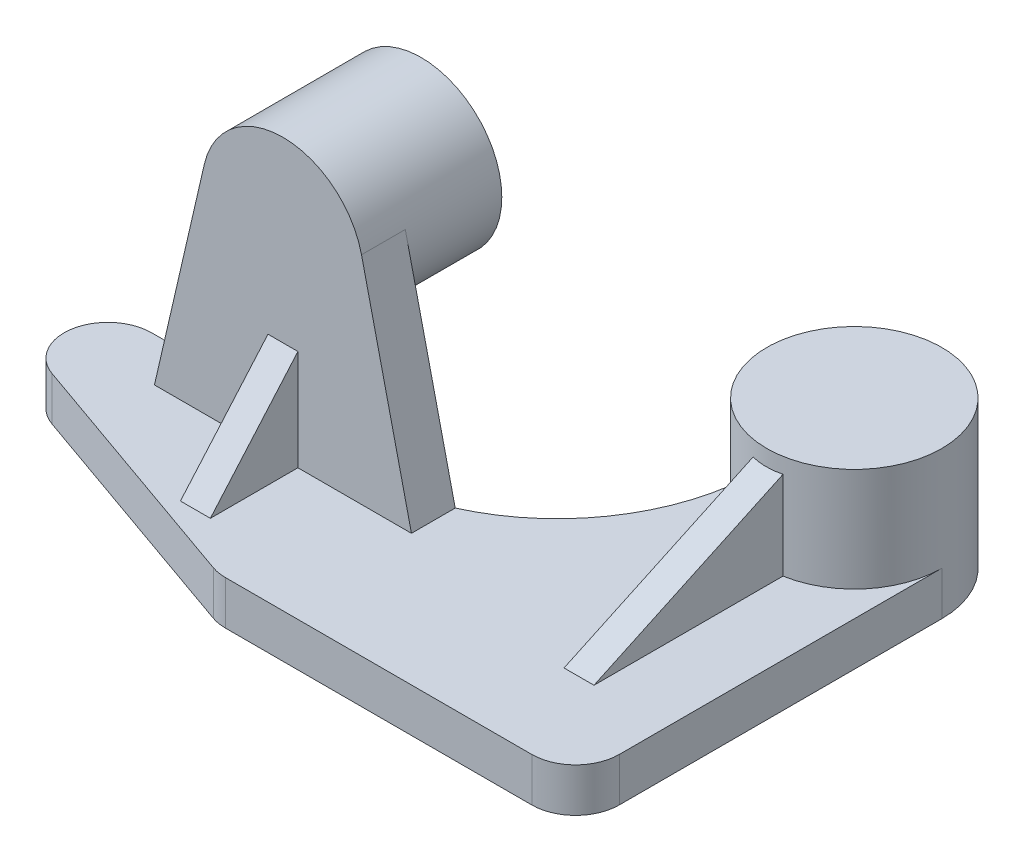
ISO-10303-21;
HEADER;
FILE_DESCRIPTION(('STEP AP214'),'2;1');
FILE_NAME('part.step','',(''),(''),'','','');
FILE_SCHEMA(('AUTOMOTIVE_DESIGN { 1 0 10303 214 1 1 1 1 }'));
ENDSEC;
DATA;
#1=APPLICATION_CONTEXT('core data for automotive mechanical design processes');
#2=APPLICATION_PROTOCOL_DEFINITION('international standard','automotive_design',2000,#1);
#3=PRODUCT_CONTEXT('',#1,'mechanical');
#4=PRODUCT('Part','Part','',(#3));
#5=PRODUCT_RELATED_PRODUCT_CATEGORY('part','',(#4));
#6=PRODUCT_DEFINITION_FORMATION('','',#4);
#7=PRODUCT_DEFINITION_CONTEXT('part definition',#1,'design');
#8=PRODUCT_DEFINITION('design','',#6,#7);
#9=PRODUCT_DEFINITION_SHAPE('','',#8);
#10=(LENGTH_UNIT() NAMED_UNIT(*) SI_UNIT(.MILLI.,.METRE.));
#11=(NAMED_UNIT(*) PLANE_ANGLE_UNIT() SI_UNIT($,.RADIAN.));
#12=(NAMED_UNIT(*) SI_UNIT($,.STERADIAN.) SOLID_ANGLE_UNIT());
#13=UNCERTAINTY_MEASURE_WITH_UNIT(LENGTH_MEASURE(1.E-05),#10,'distance_accuracy_value','');
#14=(GEOMETRIC_REPRESENTATION_CONTEXT(3) GLOBAL_UNCERTAINTY_ASSIGNED_CONTEXT((#13)) GLOBAL_UNIT_ASSIGNED_CONTEXT((#10,
#11,#12)) REPRESENTATION_CONTEXT('',''));
#15=CARTESIAN_POINT('',(0.,0.,0.));
#16=DIRECTION('',(0.,0.,1.));
#17=DIRECTION('',(1.,0.,0.));
#18=AXIS2_PLACEMENT_3D('',#15,#16,#17);
#19=CARTESIAN_POINT('',(0.,19.,-19.));
#20=DIRECTION('',(0.,0.,1.));
#21=DIRECTION('',(1.,0.,0.));
#22=AXIS2_PLACEMENT_3D('',#19,#20,#21);
#23=PLANE('',#22);
#24=DIRECTION('',(0.,-1.,0.));
#25=VECTOR('',#24,1.);
#26=CARTESIAN_POINT('',(131.775308209567,19.,-19.));
#27=LINE('',#26,#25);
#28=CARTESIAN_POINT('',(131.775308209567,19.,-19.));
#29=VERTEX_POINT('',#28);
#30=CARTESIAN_POINT('',(131.775308209567,0.,-19.));
#31=VERTEX_POINT('',#30);
#32=EDGE_CURVE('E36',#29,#31,#27,.T.);
#33=ORIENTED_EDGE('',*,*,#32,.T.);
#34=DIRECTION('',(-1.,0.,0.));
#35=VECTOR('',#34,1.);
#36=CARTESIAN_POINT('',(0.,0.,-19.));
#37=LINE('',#36,#35);
#38=CARTESIAN_POINT('',(0.,0.,-19.));
#39=VERTEX_POINT('',#38);
#40=EDGE_CURVE('E415',#31,#39,#37,.T.);
#41=ORIENTED_EDGE('',*,*,#40,.T.);
#42=DIRECTION('',(0.,-1.,0.));
#43=VECTOR('',#42,1.);
#44=CARTESIAN_POINT('',(0.,19.,-19.));
#45=LINE('',#44,#43);
#46=CARTESIAN_POINT('',(0.,19.,-19.));
#47=VERTEX_POINT('',#46);
#48=EDGE_CURVE('E465',#47,#39,#45,.T.);
#49=ORIENTED_EDGE('',*,*,#48,.F.);
#50=DIRECTION('',(-1.,0.,0.));
#51=VECTOR('',#50,1.);
#52=CARTESIAN_POINT('',(0.,19.,-19.));
#53=LINE('',#52,#51);
#54=CARTESIAN_POINT('',(20.2246917904332,19.,-19.));
#55=VERTEX_POINT('',#54);
#56=EDGE_CURVE('E389',#55,#47,#53,.T.);
#57=ORIENTED_EDGE('',*,*,#56,.F.);
#58=DIRECTION('',(-0.224951054343862,-0.974370064785236,0.));
#59=VECTOR('',#58,1.);
#60=CARTESIAN_POINT('',(20.2246917904332,19.,-19.));
#61=LINE('',#60,#59);
#62=CARTESIAN_POINT('',(41.8970477325168,112.873286902035,-19.));
#63=VERTEX_POINT('',#62);
#64=EDGE_CURVE('E338',#63,#55,#61,.T.);
#65=ORIENTED_EDGE('',*,*,#64,.F.);
#66=CARTESIAN_POINT('',(76.,105.,-19.));
#67=DIRECTION('',(0.,0.,1.));
#68=DIRECTION('',(1.,0.,0.));
#69=AXIS2_PLACEMENT_3D('',#66,#67,#68);
#70=CIRCLE('',#69,35.);
#71=CARTESIAN_POINT('',(72.1652968192097,70.2107049293143,-19.));
#72=VERTEX_POINT('',#71);
#73=EDGE_CURVE('E287',#63,#72,#70,.T.);
#74=ORIENTED_EDGE('',*,*,#73,.T.);
#75=DIRECTION('',(-1.,0.,0.));
#76=VECTOR('',#75,1.);
#77=CARTESIAN_POINT('',(82.5,70.2107049293143,-19.));
#78=LINE('',#77,#76);
#79=CARTESIAN_POINT('',(69.5,70.2107049293143,-19.));
#80=VERTEX_POINT('',#79);
#81=EDGE_CURVE('E254',#72,#80,#78,.T.);
#82=ORIENTED_EDGE('',*,*,#81,.T.);
#83=DIRECTION('',(0.,-1.,0.));
#84=VECTOR('',#83,1.);
#85=CARTESIAN_POINT('',(69.5,70.2107049293143,-19.));
#86=LINE('',#85,#84);
#87=CARTESIAN_POINT('',(69.5,19.,-19.));
#88=VERTEX_POINT('',#87);
#89=EDGE_CURVE('E272',#80,#88,#86,.T.);
#90=ORIENTED_EDGE('',*,*,#89,.T.);
#91=DIRECTION('',(-1.,0.,0.));
#92=VECTOR('',#91,1.);
#93=CARTESIAN_POINT('',(82.5,19.,-19.));
#94=LINE('',#93,#92);
#95=CARTESIAN_POINT('',(82.5,19.,-19.));
#96=VERTEX_POINT('',#95);
#97=EDGE_CURVE('E258',#96,#88,#94,.T.);
#98=ORIENTED_EDGE('',*,*,#97,.F.);
#99=DIRECTION('',(0.,-1.,0.));
#100=VECTOR('',#99,1.);
#101=CARTESIAN_POINT('',(82.5,70.2107049293143,-19.));
#102=LINE('',#101,#100);
#103=CARTESIAN_POINT('',(82.5,70.2107049293143,-19.));
#104=VERTEX_POINT('',#103);
#105=EDGE_CURVE('E239',#104,#96,#102,.T.);
#106=ORIENTED_EDGE('',*,*,#105,.F.);
#107=CARTESIAN_POINT('',(79.8347031807903,70.2107049293143,-19.));
#108=VERTEX_POINT('',#107);
#109=EDGE_CURVE('E249',#104,#108,#78,.T.);
#110=ORIENTED_EDGE('',*,*,#109,.T.);
#111=CARTESIAN_POINT('',(110.102952267483,112.873286902035,-19.));
#112=VERTEX_POINT('',#111);
#113=EDGE_CURVE('E286',#108,#112,#70,.T.);
#114=ORIENTED_EDGE('',*,*,#113,.T.);
#115=DIRECTION('',(-0.224951054343862,0.974370064785236,0.));
#116=VECTOR('',#115,1.);
#117=CARTESIAN_POINT('',(131.775308209567,19.,-19.));
#118=LINE('',#117,#116);
#119=EDGE_CURVE('E342',#29,#112,#118,.T.);
#120=ORIENTED_EDGE('',*,*,#119,.F.);
#121=EDGE_LOOP('',(#33,#41,#49,#57,#65,#74,#82,#90,#98,#106,#110,#114,#120));
#122=FACE_BOUND('',#121,.T.);
#123=ADVANCED_FACE('F15',(#122),#23,.F.);
#124=CARTESIAN_POINT('',(184.,19.,-102.));
#125=DIRECTION('',(1.,0.,0.));
#126=DIRECTION('',(0.,0.,-1.));
#127=AXIS2_PLACEMENT_3D('',#124,#125,#126);
#128=PLANE('',#127);
#129=DIRECTION('',(0.,-1.,0.));
#130=VECTOR('',#129,1.);
#131=CARTESIAN_POINT('',(184.,19.,-100.046756295927));
#132=LINE('',#131,#130);
#133=CARTESIAN_POINT('',(184.,19.,-100.046756295927));
#134=VERTEX_POINT('',#133);
#135=CARTESIAN_POINT('',(184.,0.,-100.046756295927));
#136=VERTEX_POINT('',#135);
#137=EDGE_CURVE('E46',#134,#136,#132,.T.);
#138=ORIENTED_EDGE('',*,*,#137,.F.);
#139=DIRECTION('',(0.,0.,1.));
#140=VECTOR('',#139,1.);
#141=CARTESIAN_POINT('',(184.,19.,-102.));
#142=LINE('',#141,#140);
#143=CARTESIAN_POINT('',(184.,19.,-102.));
#144=VERTEX_POINT('',#143);
#145=EDGE_CURVE('E386',#144,#134,#142,.T.);
#146=ORIENTED_EDGE('',*,*,#145,.F.);
#147=DIRECTION('',(0.,-1.,0.));
#148=VECTOR('',#147,1.);
#149=CARTESIAN_POINT('',(184.,19.,-102.));
#150=LINE('',#149,#148);
#151=CARTESIAN_POINT('',(184.,0.,-102.));
#152=VERTEX_POINT('',#151);
#153=EDGE_CURVE('E412',#144,#152,#150,.T.);
#154=ORIENTED_EDGE('',*,*,#153,.T.);
#155=DIRECTION('',(0.,0.,1.));
#156=VECTOR('',#155,1.);
#157=CARTESIAN_POINT('',(184.,0.,-102.));
#158=LINE('',#157,#156);
#159=EDGE_CURVE('E385',#152,#136,#158,.T.);
#160=ORIENTED_EDGE('',*,*,#159,.T.);
#161=EDGE_LOOP('',(#138,#146,#154,#160));
#162=FACE_BOUND('',#161,.T.);
#163=ADVANCED_FACE('F17',(#162),#128,.F.);
#164=CARTESIAN_POINT('',(0.,0.,0.));
#165=DIRECTION('',(0.,1.,0.));
#166=DIRECTION('',(0.,0.,1.));
#167=AXIS2_PLACEMENT_3D('',#164,#165,#166);
#168=PLANE('',#167);
#169=ORIENTED_EDGE('',*,*,#40,.F.);
#170=CARTESIAN_POINT('',(95.,0.,-100.046756295927));
#171=DIRECTION('',(0.,-1.,0.));
#172=DIRECTION('',(0.,0.,1.));
#173=AXIS2_PLACEMENT_3D('',#170,#171,#172);
#174=CIRCLE('',#173,89.);
#175=EDGE_CURVE('E514',#136,#31,#174,.T.);
#176=ORIENTED_EDGE('',*,*,#175,.F.);
#177=ORIENTED_EDGE('',*,*,#159,.F.);
#178=CARTESIAN_POINT('',(222.,0.,-102.));
#179=DIRECTION('',(0.,1.,0.));
#180=DIRECTION('',(0.,0.,1.));
#181=AXIS2_PLACEMENT_3D('',#178,#179,#180);
#182=CIRCLE('',#181,38.);
#183=CARTESIAN_POINT('',(260.,0.,-102.));
#184=VERTEX_POINT('',#183);
#185=EDGE_CURVE('E390',#184,#152,#182,.T.);
#186=ORIENTED_EDGE('',*,*,#185,.F.);
#187=DIRECTION('',(0.,0.,-1.));
#188=VECTOR('',#187,1.);
#189=CARTESIAN_POINT('',(260.,0.,38.));
#190=LINE('',#189,#188);
#191=CARTESIAN_POINT('',(260.,0.,38.));
#192=VERTEX_POINT('',#191);
#193=EDGE_CURVE('E433',#192,#184,#190,.T.);
#194=ORIENTED_EDGE('',*,*,#193,.F.);
#195=CARTESIAN_POINT('',(241.,0.,38.));
#196=DIRECTION('',(0.,1.,0.));
#197=DIRECTION('',(0.,0.,1.));
#198=AXIS2_PLACEMENT_3D('',#195,#196,#197);
#199=CIRCLE('',#198,19.);
#200=CARTESIAN_POINT('',(241.,0.,57.));
#201=VERTEX_POINT('',#200);
#202=EDGE_CURVE('E430',#201,#192,#199,.T.);
#203=ORIENTED_EDGE('',*,*,#202,.F.);
#204=DIRECTION('',(1.,0.,0.));
#205=VECTOR('',#204,1.);
#206=CARTESIAN_POINT('',(108.,0.,57.));
#207=LINE('',#206,#205);
#208=CARTESIAN_POINT('',(108.,0.,57.));
#209=VERTEX_POINT('',#208);
#210=EDGE_CURVE('E427',#209,#201,#207,.T.);
#211=ORIENTED_EDGE('',*,*,#210,.F.);
#212=CARTESIAN_POINT('',(108.,0.,38.));
#213=DIRECTION('',(0.,1.,0.));
#214=DIRECTION('',(0.,0.,1.));
#215=AXIS2_PLACEMENT_3D('',#212,#213,#214);
#216=CIRCLE('',#215,19.);
#217=CARTESIAN_POINT('',(101.693781979772,0.,55.9229354259104));
#218=VERTEX_POINT('',#217);
#219=EDGE_CURVE('E424',#218,#209,#216,.T.);
#220=ORIENTED_EDGE('',*,*,#219,.F.);
#221=DIRECTION('',(0.943312390837391,0.,0.331906211590934));
#222=VECTOR('',#221,1.);
#223=CARTESIAN_POINT('',(-6.30621802022775,0.,17.9229354259104));
#224=LINE('',#223,#222);
#225=CARTESIAN_POINT('',(-6.30621802022775,0.,17.9229354259104));
#226=VERTEX_POINT('',#225);
#227=EDGE_CURVE('E421',#226,#218,#224,.T.);
#228=ORIENTED_EDGE('',*,*,#227,.F.);
#229=CARTESIAN_POINT('',(0.,0.,0.));
#230=DIRECTION('',(0.,1.,0.));
#231=DIRECTION('',(0.,0.,1.));
#232=AXIS2_PLACEMENT_3D('',#229,#230,#231);
#233=CIRCLE('',#232,19.);
#234=EDGE_CURVE('E418',#39,#226,#233,.T.);
#235=ORIENTED_EDGE('',*,*,#234,.F.);
#236=EDGE_LOOP('',(#169,#176,#177,#186,#194,#203,#211,#220,#228,#235));
#237=FACE_BOUND('',#236,.T.);
#238=ADVANCED_FACE('F949',(#237),#168,.F.);
#239=CARTESIAN_POINT('',(222.,64.,-102.));
#240=DIRECTION('',(0.,1.,0.));
#241=DIRECTION('',(0.,0.,1.));
#242=AXIS2_PLACEMENT_3D('',#239,#240,#241);
#243=PLANE('',#242);
#244=CARTESIAN_POINT('',(222.,64.,-102.));
#245=DIRECTION('',(0.,1.,0.));
#246=DIRECTION('',(0.,0.,1.));
#247=AXIS2_PLACEMENT_3D('',#244,#245,#246);
#248=CIRCLE('',#247,38.);
#249=CARTESIAN_POINT('',(222.,64.,-64.));
#250=VERTEX_POINT('',#249);
#251=EDGE_CURVE('E366',#250,#250,#248,.T.);
#252=ORIENTED_EDGE('',*,*,#251,.T.);
#253=EDGE_LOOP('',(#252));
#254=FACE_BOUND('',#253,.T.);
#255=ADVANCED_FACE('F941',(#254),#243,.T.);
#256=CARTESIAN_POINT('',(76.,105.,-19.));
#257=DIRECTION('',(0.,0.,1.));
#258=DIRECTION('',(1.,0.,0.));
#259=AXIS2_PLACEMENT_3D('',#256,#257,#258);
#260=CYLINDRICAL_SURFACE('',#259,35.);
#261=CARTESIAN_POINT('',(76.,105.,-60.));
#262=DIRECTION('',(0.,0.,1.));
#263=DIRECTION('',(1.,0.,0.));
#264=AXIS2_PLACEMENT_3D('',#261,#262,#263);
#265=CIRCLE('',#264,35.);
#266=CARTESIAN_POINT('',(111.,105.,-60.));
#267=VERTEX_POINT('',#266);
#268=EDGE_CURVE('E253',#267,#267,#265,.T.);
#269=ORIENTED_EDGE('',*,*,#268,.T.);
#270=EDGE_LOOP('',(#269));
#271=FACE_BOUND('',#270,.T.);
#272=ORIENTED_EDGE('',*,*,#113,.F.);
#273=DIRECTION('',(0.,0.,1.));
#274=VECTOR('',#273,1.);
#275=CARTESIAN_POINT('',(79.8347031807903,70.2107049293143,-19.));
#276=LINE('',#275,#274);
#277=CARTESIAN_POINT('',(79.8347031807904,70.2107049293143,-51.));
#278=VERTEX_POINT('',#277);
#279=EDGE_CURVE('E10',#108,#278,#276,.F.);
#280=ORIENTED_EDGE('',*,*,#279,.T.);
#281=CARTESIAN_POINT('',(76.,105.,-72.7387642642014));
#282=DIRECTION('',(0.,0.5299192642332,0.848048096156429));
#283=DIRECTION('',(0.,-0.84804809615643,0.5299192642332));
#284=AXIS2_PLACEMENT_3D('',#281,#282,#283);
#285=ELLIPSE('',#284,41.2712441176732,35.);
#286=CARTESIAN_POINT('',(72.1652968192096,70.2107049293143,-51.));
#287=VERTEX_POINT('',#286);
#288=EDGE_CURVE('E480',#278,#287,#285,.F.);
#289=ORIENTED_EDGE('',*,*,#288,.T.);
#290=DIRECTION('',(0.,0.,1.));
#291=VECTOR('',#290,1.);
#292=CARTESIAN_POINT('',(72.1652968192097,70.2107049293143,-19.));
#293=LINE('',#292,#291);
#294=EDGE_CURVE('E24',#287,#72,#293,.T.);
#295=ORIENTED_EDGE('',*,*,#294,.T.);
#296=ORIENTED_EDGE('',*,*,#73,.F.);
#297=DIRECTION('',(0.,0.,1.));
#298=VECTOR('',#297,1.);
#299=CARTESIAN_POINT('',(41.8970477325168,112.873286902035,-19.));
#300=LINE('',#299,#298);
#301=CARTESIAN_POINT('',(41.8970477325168,112.873286902035,0.));
#302=VERTEX_POINT('',#301);
#303=EDGE_CURVE('E363',#63,#302,#300,.T.);
#304=ORIENTED_EDGE('',*,*,#303,.T.);
#305=CARTESIAN_POINT('',(76.,105.,0.));
#306=DIRECTION('',(0.,0.,1.));
#307=DIRECTION('',(1.,0.,0.));
#308=AXIS2_PLACEMENT_3D('',#305,#306,#307);
#309=CIRCLE('',#308,35.);
#310=CARTESIAN_POINT('',(110.102952267483,112.873286902035,0.));
#311=VERTEX_POINT('',#310);
#312=EDGE_CURVE('E343',#311,#302,#309,.T.);
#313=ORIENTED_EDGE('',*,*,#312,.F.);
#314=DIRECTION('',(0.,0.,1.));
#315=VECTOR('',#314,1.);
#316=CARTESIAN_POINT('',(110.102952267483,112.873286902035,-19.));
#317=LINE('',#316,#315);
#318=EDGE_CURVE('E367',#112,#311,#317,.T.);
#319=ORIENTED_EDGE('',*,*,#318,.F.);
#320=EDGE_LOOP('',(#272,#280,#289,#295,#296,#304,#313,#319));
#321=FACE_BOUND('',#320,.T.);
#322=ADVANCED_FACE('F488',(#271,#321),#260,.T.);
#323=CARTESIAN_POINT('',(0.,19.,0.));
#324=DIRECTION('',(0.,1.,0.));
#325=DIRECTION('',(0.,0.,1.));
#326=AXIS2_PLACEMENT_3D('',#323,#324,#325);
#327=PLANE('',#326);
#328=CARTESIAN_POINT('',(95.,19.,-100.046756295927));
#329=DIRECTION('',(0.,-1.,0.));
#330=DIRECTION('',(0.,0.,1.));
#331=AXIS2_PLACEMENT_3D('',#328,#329,#330);
#332=CIRCLE('',#331,89.);
#333=EDGE_CURVE('E510',#134,#29,#332,.T.);
#334=ORIENTED_EDGE('',*,*,#333,.T.);
#335=DIRECTION('',(0.,0.,1.));
#336=VECTOR('',#335,1.);
#337=CARTESIAN_POINT('',(131.775308209567,19.,-19.));
#338=LINE('',#337,#336);
#339=CARTESIAN_POINT('',(131.775308209567,19.,0.));
#340=VERTEX_POINT('',#339);
#341=EDGE_CURVE('E370',#29,#340,#338,.T.);
#342=ORIENTED_EDGE('',*,*,#341,.T.);
#343=DIRECTION('',(1.,0.,0.));
#344=VECTOR('',#343,1.);
#345=CARTESIAN_POINT('',(20.2246917904332,19.,0.));
#346=LINE('',#345,#344);
#347=CARTESIAN_POINT('',(82.5,19.,0.));
#348=VERTEX_POINT('',#347);
#349=EDGE_CURVE('E351',#348,#340,#346,.T.);
#350=ORIENTED_EDGE('',*,*,#349,.F.);
#351=DIRECTION('',(0.,0.,-1.));
#352=VECTOR('',#351,1.);
#353=CARTESIAN_POINT('',(82.5,19.,0.));
#354=LINE('',#353,#352);
#355=CARTESIAN_POINT('',(82.5,19.,38.));
#356=VERTEX_POINT('',#355);
#357=EDGE_CURVE('E295',#356,#348,#354,.T.);
#358=ORIENTED_EDGE('',*,*,#357,.F.);
#359=DIRECTION('',(-1.,0.,0.));
#360=VECTOR('',#359,1.);
#361=CARTESIAN_POINT('',(82.5,19.,38.));
#362=LINE('',#361,#360);
#363=CARTESIAN_POINT('',(69.5,19.,38.));
#364=VERTEX_POINT('',#363);
#365=EDGE_CURVE('E316',#356,#364,#362,.T.);
#366=ORIENTED_EDGE('',*,*,#365,.T.);
#367=DIRECTION('',(0.,0.,-1.));
#368=VECTOR('',#367,1.);
#369=CARTESIAN_POINT('',(69.5,19.,0.));
#370=LINE('',#369,#368);
#371=CARTESIAN_POINT('',(69.5,19.,0.));
#372=VERTEX_POINT('',#371);
#373=EDGE_CURVE('E306',#364,#372,#370,.T.);
#374=ORIENTED_EDGE('',*,*,#373,.T.);
#375=CARTESIAN_POINT('',(20.2246917904332,19.,0.));
#376=VERTEX_POINT('',#375);
#377=EDGE_CURVE('E352',#376,#372,#346,.T.);
#378=ORIENTED_EDGE('',*,*,#377,.F.);
#379=DIRECTION('',(0.,0.,1.));
#380=VECTOR('',#379,1.);
#381=CARTESIAN_POINT('',(20.2246917904332,19.,-19.));
#382=LINE('',#381,#380);
#383=EDGE_CURVE('E347',#55,#376,#382,.T.);
#384=ORIENTED_EDGE('',*,*,#383,.F.);
#385=ORIENTED_EDGE('',*,*,#56,.T.);
#386=CARTESIAN_POINT('',(0.,19.,0.));
#387=DIRECTION('',(0.,1.,0.));
#388=DIRECTION('',(0.,0.,1.));
#389=AXIS2_PLACEMENT_3D('',#386,#387,#388);
#390=CIRCLE('',#389,19.);
#391=CARTESIAN_POINT('',(-6.30621802022775,19.,17.9229354259104));
#392=VERTEX_POINT('',#391);
#393=EDGE_CURVE('E393',#47,#392,#390,.T.);
#394=ORIENTED_EDGE('',*,*,#393,.T.);
#395=DIRECTION('',(0.943312390837391,0.,0.331906211590934));
#396=VECTOR('',#395,1.);
#397=CARTESIAN_POINT('',(-6.30621802022775,19.,17.9229354259104));
#398=LINE('',#397,#396);
#399=CARTESIAN_POINT('',(101.693781979772,19.,55.9229354259104));
#400=VERTEX_POINT('',#399);
#401=EDGE_CURVE('E396',#392,#400,#398,.T.);
#402=ORIENTED_EDGE('',*,*,#401,.T.);
#403=CARTESIAN_POINT('',(108.,19.,38.));
#404=DIRECTION('',(0.,1.,0.));
#405=DIRECTION('',(0.,0.,1.));
#406=AXIS2_PLACEMENT_3D('',#403,#404,#405);
#407=CIRCLE('',#406,19.);
#408=CARTESIAN_POINT('',(108.,19.,57.));
#409=VERTEX_POINT('',#408);
#410=EDGE_CURVE('E399',#400,#409,#407,.T.);
#411=ORIENTED_EDGE('',*,*,#410,.T.);
#412=DIRECTION('',(1.,0.,0.));
#413=VECTOR('',#412,1.);
#414=CARTESIAN_POINT('',(108.,19.,57.));
#415=LINE('',#414,#413);
#416=CARTESIAN_POINT('',(241.,19.,57.));
#417=VERTEX_POINT('',#416);
#418=EDGE_CURVE('E402',#409,#417,#415,.T.);
#419=ORIENTED_EDGE('',*,*,#418,.T.);
#420=CARTESIAN_POINT('',(241.,19.,38.));
#421=DIRECTION('',(0.,1.,0.));
#422=DIRECTION('',(0.,0.,1.));
#423=AXIS2_PLACEMENT_3D('',#420,#421,#422);
#424=CIRCLE('',#423,19.);
#425=CARTESIAN_POINT('',(260.,19.,38.));
#426=VERTEX_POINT('',#425);
#427=EDGE_CURVE('E405',#417,#426,#424,.T.);
#428=ORIENTED_EDGE('',*,*,#427,.T.);
#429=DIRECTION('',(0.,0.,-1.));
#430=VECTOR('',#429,1.);
#431=CARTESIAN_POINT('',(260.,19.,38.));
#432=LINE('',#431,#430);
#433=CARTESIAN_POINT('',(260.,19.,-102.));
#434=VERTEX_POINT('',#433);
#435=EDGE_CURVE('E408',#426,#434,#432,.T.);
#436=ORIENTED_EDGE('',*,*,#435,.T.);
#437=CARTESIAN_POINT('',(222.,19.,-102.));
#438=DIRECTION('',(0.,1.,0.));
#439=DIRECTION('',(0.,0.,1.));
#440=AXIS2_PLACEMENT_3D('',#437,#438,#439);
#441=CIRCLE('',#440,38.);
#442=CARTESIAN_POINT('',(228.5,19.,-64.5600480769539));
#443=VERTEX_POINT('',#442);
#444=EDGE_CURVE('E381',#434,#443,#441,.F.);
#445=ORIENTED_EDGE('',*,*,#444,.T.);
#446=DIRECTION('',(0.,0.,-1.));
#447=VECTOR('',#446,1.);
#448=CARTESIAN_POINT('',(228.5,19.,17.4912629793646));
#449=LINE('',#448,#447);
#450=CARTESIAN_POINT('',(228.5,19.,17.4912629793646));
#451=VERTEX_POINT('',#450);
#452=EDGE_CURVE('E324',#451,#443,#449,.T.);
#453=ORIENTED_EDGE('',*,*,#452,.F.);
#454=DIRECTION('',(-1.,0.,0.));
#455=VECTOR('',#454,1.);
#456=CARTESIAN_POINT('',(228.5,19.,17.4912629793646));
#457=LINE('',#456,#455);
#458=CARTESIAN_POINT('',(215.5,19.,17.4912629793646));
#459=VERTEX_POINT('',#458);
#460=EDGE_CURVE('E328',#451,#459,#457,.T.);
#461=ORIENTED_EDGE('',*,*,#460,.T.);
#462=DIRECTION('',(0.,0.,-1.));
#463=VECTOR('',#462,1.);
#464=CARTESIAN_POINT('',(215.5,19.,17.4912629793646));
#465=LINE('',#464,#463);
#466=CARTESIAN_POINT('',(215.5,19.,-64.5600480769539));
#467=VERTEX_POINT('',#466);
#468=EDGE_CURVE('E325',#459,#467,#465,.T.);
#469=ORIENTED_EDGE('',*,*,#468,.T.);
#470=EDGE_CURVE('E380',#467,#144,#441,.F.);
#471=ORIENTED_EDGE('',*,*,#470,.T.);
#472=ORIENTED_EDGE('',*,*,#145,.T.);
#473=EDGE_LOOP('',(#334,#342,#350,#358,#366,#374,#378,#384,#385,#394,#402,#411,#419,#428,#436,
#445,#453,#461,#469,#471,#472));
#474=FACE_BOUND('',#473,.T.);
#475=ADVANCED_FACE('F511',(#474),#327,.T.);
#476=CARTESIAN_POINT('',(222.,19.,-102.));
#477=DIRECTION('',(0.,-1.,0.));
#478=DIRECTION('',(0.,0.,-1.));
#479=AXIS2_PLACEMENT_3D('',#476,#477,#478);
#480=CYLINDRICAL_SURFACE('',#479,38.);
#481=ORIENTED_EDGE('',*,*,#251,.F.);
#482=EDGE_LOOP('',(#481));
#483=FACE_BOUND('',#482,.T.);
#484=DIRECTION('',(0.,-1.,0.));
#485=VECTOR('',#484,1.);
#486=CARTESIAN_POINT('',(228.5,19.,-64.5600480769539));
#487=LINE('',#486,#485);
#488=CARTESIAN_POINT('',(228.5,57.2611547072186,-64.5600480769539));
#489=VERTEX_POINT('',#488);
#490=EDGE_CURVE('E477',#443,#489,#487,.F.);
#491=ORIENTED_EDGE('',*,*,#490,.F.);
#492=ORIENTED_EDGE('',*,*,#444,.F.);
#493=DIRECTION('',(0.,-1.,0.));
#494=VECTOR('',#493,1.);
#495=CARTESIAN_POINT('',(260.,19.,-102.));
#496=LINE('',#495,#494);
#497=EDGE_CURVE('E441',#434,#184,#496,.T.);
#498=ORIENTED_EDGE('',*,*,#497,.T.);
#499=ORIENTED_EDGE('',*,*,#185,.T.);
#500=ORIENTED_EDGE('',*,*,#153,.F.);
#501=ORIENTED_EDGE('',*,*,#470,.F.);
#502=DIRECTION('',(0.,-1.,0.));
#503=VECTOR('',#502,1.);
#504=CARTESIAN_POINT('',(215.5,19.,-64.5600480769539));
#505=LINE('',#504,#503);
#506=CARTESIAN_POINT('',(215.5,57.2611547072186,-64.5600480769539));
#507=VERTEX_POINT('',#506);
#508=EDGE_CURVE('E469',#467,#507,#505,.F.);
#509=ORIENTED_EDGE('',*,*,#508,.T.);
#510=CARTESIAN_POINT('',(222.,74.7196910098896,-102.));
#511=DIRECTION('',(0.,-0.906307787036653,-0.422618261740694));
#512=DIRECTION('',(0.,-0.422618261740694,0.906307787036653));
#513=AXIS2_PLACEMENT_3D('',#510,#511,#512);
#514=ELLIPSE('',#513,41.9283609205746,38.);
#515=EDGE_CURVE('E473',#489,#507,#514,.T.);
#516=ORIENTED_EDGE('',*,*,#515,.F.);
#517=EDGE_LOOP('',(#491,#492,#498,#499,#500,#501,#509,#516));
#518=FACE_BOUND('',#517,.T.);
#519=ADVANCED_FACE('F920',(#483,#518),#480,.T.);
#520=CARTESIAN_POINT('',(0.,19.,0.));
#521=DIRECTION('',(0.,-1.,0.));
#522=DIRECTION('',(0.,0.,-1.));
#523=AXIS2_PLACEMENT_3D('',#520,#521,#522);
#524=CYLINDRICAL_SURFACE('',#523,19.);
#525=ORIENTED_EDGE('',*,*,#234,.T.);
#526=DIRECTION('',(0.,-1.,0.));
#527=VECTOR('',#526,1.);
#528=CARTESIAN_POINT('',(-6.30621802022775,19.,17.9229354259104));
#529=LINE('',#528,#527);
#530=EDGE_CURVE('E461',#392,#226,#529,.T.);
#531=ORIENTED_EDGE('',*,*,#530,.F.);
#532=ORIENTED_EDGE('',*,*,#393,.F.);
#533=ORIENTED_EDGE('',*,*,#48,.T.);
#534=EDGE_LOOP('',(#525,#531,#532,#533));
#535=FACE_BOUND('',#534,.T.);
#536=ADVANCED_FACE('F912',(#535),#524,.T.);
#537=CARTESIAN_POINT('',(-6.30621802022775,19.,17.9229354259104));
#538=DIRECTION('',(0.331906211590934,0.,-0.943312390837391));
#539=DIRECTION('',(-0.943312390837391,0.,-0.331906211590934));
#540=AXIS2_PLACEMENT_3D('',#537,#538,#539);
#541=PLANE('',#540);
#542=ORIENTED_EDGE('',*,*,#227,.T.);
#543=DIRECTION('',(0.,-1.,0.));
#544=VECTOR('',#543,1.);
#545=CARTESIAN_POINT('',(101.693781979772,19.,55.9229354259104));
#546=LINE('',#545,#544);
#547=EDGE_CURVE('E457',#400,#218,#546,.T.);
#548=ORIENTED_EDGE('',*,*,#547,.F.);
#549=ORIENTED_EDGE('',*,*,#401,.F.);
#550=ORIENTED_EDGE('',*,*,#530,.T.);
#551=EDGE_LOOP('',(#542,#548,#549,#550));
#552=FACE_BOUND('',#551,.T.);
#553=ADVANCED_FACE('F904',(#552),#541,.F.);
#554=CARTESIAN_POINT('',(108.,19.,38.));
#555=DIRECTION('',(0.,-1.,0.));
#556=DIRECTION('',(0.,0.,-1.));
#557=AXIS2_PLACEMENT_3D('',#554,#555,#556);
#558=CYLINDRICAL_SURFACE('',#557,19.);
#559=ORIENTED_EDGE('',*,*,#219,.T.);
#560=DIRECTION('',(0.,-1.,0.));
#561=VECTOR('',#560,1.);
#562=CARTESIAN_POINT('',(108.,19.,57.));
#563=LINE('',#562,#561);
#564=EDGE_CURVE('E453',#409,#209,#563,.T.);
#565=ORIENTED_EDGE('',*,*,#564,.F.);
#566=ORIENTED_EDGE('',*,*,#410,.F.);
#567=ORIENTED_EDGE('',*,*,#547,.T.);
#568=EDGE_LOOP('',(#559,#565,#566,#567));
#569=FACE_BOUND('',#568,.T.);
#570=ADVANCED_FACE('F896',(#569),#558,.T.);
#571=CARTESIAN_POINT('',(108.,19.,57.));
#572=DIRECTION('',(0.,0.,-1.));
#573=DIRECTION('',(-1.,0.,0.));
#574=AXIS2_PLACEMENT_3D('',#571,#572,#573);
#575=PLANE('',#574);
#576=ORIENTED_EDGE('',*,*,#210,.T.);
#577=DIRECTION('',(0.,-1.,0.));
#578=VECTOR('',#577,1.);
#579=CARTESIAN_POINT('',(241.,19.,57.));
#580=LINE('',#579,#578);
#581=EDGE_CURVE('E449',#417,#201,#580,.T.);
#582=ORIENTED_EDGE('',*,*,#581,.F.);
#583=ORIENTED_EDGE('',*,*,#418,.F.);
#584=ORIENTED_EDGE('',*,*,#564,.T.);
#585=EDGE_LOOP('',(#576,#582,#583,#584));
#586=FACE_BOUND('',#585,.T.);
#587=ADVANCED_FACE('F888',(#586),#575,.F.);
#588=CARTESIAN_POINT('',(241.,19.,38.));
#589=DIRECTION('',(0.,-1.,0.));
#590=DIRECTION('',(0.,0.,-1.));
#591=AXIS2_PLACEMENT_3D('',#588,#589,#590);
#592=CYLINDRICAL_SURFACE('',#591,19.);
#593=ORIENTED_EDGE('',*,*,#202,.T.);
#594=DIRECTION('',(0.,-1.,0.));
#595=VECTOR('',#594,1.);
#596=CARTESIAN_POINT('',(260.,19.,38.));
#597=LINE('',#596,#595);
#598=EDGE_CURVE('E445',#426,#192,#597,.T.);
#599=ORIENTED_EDGE('',*,*,#598,.F.);
#600=ORIENTED_EDGE('',*,*,#427,.F.);
#601=ORIENTED_EDGE('',*,*,#581,.T.);
#602=EDGE_LOOP('',(#593,#599,#600,#601));
#603=FACE_BOUND('',#602,.T.);
#604=ADVANCED_FACE('F880',(#603),#592,.T.);
#605=CARTESIAN_POINT('',(260.,19.,38.));
#606=DIRECTION('',(-1.,0.,0.));
#607=DIRECTION('',(0.,0.,1.));
#608=AXIS2_PLACEMENT_3D('',#605,#606,#607);
#609=PLANE('',#608);
#610=ORIENTED_EDGE('',*,*,#193,.T.);
#611=ORIENTED_EDGE('',*,*,#497,.F.);
#612=ORIENTED_EDGE('',*,*,#435,.F.);
#613=ORIENTED_EDGE('',*,*,#598,.T.);
#614=EDGE_LOOP('',(#610,#611,#612,#613));
#615=FACE_BOUND('',#614,.T.);
#616=ADVANCED_FACE('F873',(#615),#609,.F.);
#617=CARTESIAN_POINT('',(20.2246917904332,19.,-19.));
#618=DIRECTION('',(-0.974370064785236,0.224951054343862,0.));
#619=DIRECTION('',(-0.224951054343862,-0.974370064785236,0.));
#620=AXIS2_PLACEMENT_3D('',#617,#618,#619);
#621=PLANE('',#620);
#622=DIRECTION('',(-0.224951054343862,-0.974370064785236,0.));
#623=VECTOR('',#622,1.);
#624=CARTESIAN_POINT('',(20.2246917904332,19.,0.));
#625=LINE('',#624,#623);
#626=EDGE_CURVE('E337',#302,#376,#625,.T.);
#627=ORIENTED_EDGE('',*,*,#626,.F.);
#628=ORIENTED_EDGE('',*,*,#303,.F.);
#629=ORIENTED_EDGE('',*,*,#64,.T.);
#630=ORIENTED_EDGE('',*,*,#383,.T.);
#631=EDGE_LOOP('',(#627,#628,#629,#630));
#632=FACE_BOUND('',#631,.T.);
#633=ADVANCED_FACE('F497',(#632),#621,.T.);
#634=CARTESIAN_POINT('',(131.775308209567,19.,-19.));
#635=DIRECTION('',(0.974370064785236,0.224951054343862,0.));
#636=DIRECTION('',(-0.224951054343862,0.974370064785236,0.));
#637=AXIS2_PLACEMENT_3D('',#634,#635,#636);
#638=PLANE('',#637);
#639=DIRECTION('',(-0.224951054343862,0.974370064785236,0.));
#640=VECTOR('',#639,1.);
#641=CARTESIAN_POINT('',(131.775308209567,19.,0.));
#642=LINE('',#641,#640);
#643=EDGE_CURVE('E356',#340,#311,#642,.T.);
#644=ORIENTED_EDGE('',*,*,#643,.F.);
#645=ORIENTED_EDGE('',*,*,#341,.F.);
#646=ORIENTED_EDGE('',*,*,#119,.T.);
#647=ORIENTED_EDGE('',*,*,#318,.T.);
#648=EDGE_LOOP('',(#644,#645,#646,#647));
#649=FACE_BOUND('',#648,.T.);
#650=ADVANCED_FACE('F506',(#649),#638,.T.);
#651=CARTESIAN_POINT('',(76.,105.,0.));
#652=DIRECTION('',(0.,0.,1.));
#653=DIRECTION('',(1.,0.,0.));
#654=AXIS2_PLACEMENT_3D('',#651,#652,#653);
#655=PLANE('',#654);
#656=ORIENTED_EDGE('',*,*,#643,.T.);
#657=ORIENTED_EDGE('',*,*,#312,.T.);
#658=ORIENTED_EDGE('',*,*,#626,.T.);
#659=ORIENTED_EDGE('',*,*,#377,.T.);
#660=DIRECTION('',(0.,1.,0.));
#661=VECTOR('',#660,1.);
#662=CARTESIAN_POINT('',(69.5,62.7139994743979,0.));
#663=LINE('',#662,#661);
#664=CARTESIAN_POINT('',(69.5,62.7139994743979,0.));
#665=VERTEX_POINT('',#664);
#666=EDGE_CURVE('E296',#372,#665,#663,.T.);
#667=ORIENTED_EDGE('',*,*,#666,.T.);
#668=DIRECTION('',(-1.,0.,0.));
#669=VECTOR('',#668,1.);
#670=CARTESIAN_POINT('',(82.5,62.7139994743979,0.));
#671=LINE('',#670,#669);
#672=CARTESIAN_POINT('',(82.5,62.7139994743979,0.));
#673=VERTEX_POINT('',#672);
#674=EDGE_CURVE('E302',#673,#665,#671,.T.);
#675=ORIENTED_EDGE('',*,*,#674,.F.);
#676=DIRECTION('',(0.,1.,0.));
#677=VECTOR('',#676,1.);
#678=CARTESIAN_POINT('',(82.5,62.7139994743979,0.));
#679=LINE('',#678,#677);
#680=EDGE_CURVE('E299',#348,#673,#679,.T.);
#681=ORIENTED_EDGE('',*,*,#680,.F.);
#682=ORIENTED_EDGE('',*,*,#349,.T.);
#683=EDGE_LOOP('',(#656,#657,#658,#659,#667,#675,#681,#682));
#684=FACE_BOUND('',#683,.T.);
#685=ADVANCED_FACE('F501',(#684),#655,.T.);
#686=CARTESIAN_POINT('',(228.5,59.8192550690191,-70.0459120061933));
#687=DIRECTION('',(0.,-0.906307787036653,-0.422618261740694));
#688=DIRECTION('',(0.,0.422618261740694,-0.906307787036653));
#689=AXIS2_PLACEMENT_3D('',#686,#687,#688);
#690=PLANE('',#689);
#691=DIRECTION('',(0.,-0.422618261740694,0.906307787036653));
#692=VECTOR('',#691,1.);
#693=CARTESIAN_POINT('',(228.5,59.8192550690191,-70.0459120061933));
#694=LINE('',#693,#692);
#695=EDGE_CURVE('E321',#489,#451,#694,.T.);
#696=ORIENTED_EDGE('',*,*,#695,.F.);
#697=ORIENTED_EDGE('',*,*,#515,.T.);
#698=DIRECTION('',(0.,-0.422618261740694,0.906307787036653));
#699=VECTOR('',#698,1.);
#700=CARTESIAN_POINT('',(215.5,59.8192550690191,-70.0459120061933));
#701=LINE('',#700,#699);
#702=EDGE_CURVE('E320',#507,#459,#701,.T.);
#703=ORIENTED_EDGE('',*,*,#702,.T.);
#704=ORIENTED_EDGE('',*,*,#460,.F.);
#705=EDGE_LOOP('',(#696,#697,#703,#704));
#706=FACE_BOUND('',#705,.T.);
#707=ADVANCED_FACE('F846',(#706),#690,.F.);
#708=CARTESIAN_POINT('',(228.5,0.,0.));
#709=DIRECTION('',(-1.,0.,0.));
#710=DIRECTION('',(0.,0.,1.));
#711=AXIS2_PLACEMENT_3D('',#708,#709,#710);
#712=PLANE('',#711);
#713=ORIENTED_EDGE('',*,*,#452,.T.);
#714=ORIENTED_EDGE('',*,*,#490,.T.);
#715=ORIENTED_EDGE('',*,*,#695,.T.);
#716=EDGE_LOOP('',(#713,#714,#715));
#717=FACE_BOUND('',#716,.T.);
#718=ADVANCED_FACE('F838',(#717),#712,.F.);
#719=CARTESIAN_POINT('',(215.5,0.,0.));
#720=DIRECTION('',(-1.,0.,0.));
#721=DIRECTION('',(0.,0.,1.));
#722=AXIS2_PLACEMENT_3D('',#719,#720,#721);
#723=PLANE('',#722);
#724=ORIENTED_EDGE('',*,*,#508,.F.);
#725=ORIENTED_EDGE('',*,*,#468,.F.);
#726=ORIENTED_EDGE('',*,*,#702,.F.);
#727=EDGE_LOOP('',(#724,#725,#726));
#728=FACE_BOUND('',#727,.T.);
#729=ADVANCED_FACE('F830',(#728),#723,.T.);
#730=CARTESIAN_POINT('',(82.5,19.,38.));
#731=DIRECTION('',(0.,-0.656059028990511,-0.754709580222769));
#732=DIRECTION('',(0.,0.754709580222769,-0.656059028990511));
#733=AXIS2_PLACEMENT_3D('',#730,#731,#732);
#734=PLANE('',#733);
#735=DIRECTION('',(0.,-0.754709580222769,0.656059028990511));
#736=VECTOR('',#735,1.);
#737=CARTESIAN_POINT('',(69.5,19.,38.));
#738=LINE('',#737,#736);
#739=EDGE_CURVE('E291',#665,#364,#738,.T.);
#740=ORIENTED_EDGE('',*,*,#739,.T.);
#741=ORIENTED_EDGE('',*,*,#365,.F.);
#742=DIRECTION('',(0.,-0.754709580222769,0.656059028990511));
#743=VECTOR('',#742,1.);
#744=CARTESIAN_POINT('',(82.5,19.,38.));
#745=LINE('',#744,#743);
#746=EDGE_CURVE('E292',#673,#356,#745,.T.);
#747=ORIENTED_EDGE('',*,*,#746,.F.);
#748=ORIENTED_EDGE('',*,*,#674,.T.);
#749=EDGE_LOOP('',(#740,#741,#747,#748));
#750=FACE_BOUND('',#749,.T.);
#751=ADVANCED_FACE('F822',(#750),#734,.F.);
#752=CARTESIAN_POINT('',(82.5,0.,0.));
#753=DIRECTION('',(1.,0.,0.));
#754=DIRECTION('',(0.,0.,-1.));
#755=AXIS2_PLACEMENT_3D('',#752,#753,#754);
#756=PLANE('',#755);
#757=ORIENTED_EDGE('',*,*,#746,.T.);
#758=ORIENTED_EDGE('',*,*,#357,.T.);
#759=ORIENTED_EDGE('',*,*,#680,.T.);
#760=EDGE_LOOP('',(#757,#758,#759));
#761=FACE_BOUND('',#760,.T.);
#762=ADVANCED_FACE('F814',(#761),#756,.T.);
#763=CARTESIAN_POINT('',(69.5,0.,0.));
#764=DIRECTION('',(1.,0.,0.));
#765=DIRECTION('',(0.,0.,-1.));
#766=AXIS2_PLACEMENT_3D('',#763,#764,#765);
#767=PLANE('',#766);
#768=ORIENTED_EDGE('',*,*,#739,.F.);
#769=ORIENTED_EDGE('',*,*,#666,.F.);
#770=ORIENTED_EDGE('',*,*,#373,.F.);
#771=EDGE_LOOP('',(#768,#769,#770));
#772=FACE_BOUND('',#771,.T.);
#773=ADVANCED_FACE('F806',(#772),#767,.F.);
#774=CARTESIAN_POINT('',(76.,105.,-60.));
#775=DIRECTION('',(0.,0.,1.));
#776=DIRECTION('',(1.,0.,0.));
#777=AXIS2_PLACEMENT_3D('',#774,#775,#776);
#778=PLANE('',#777);
#779=ORIENTED_EDGE('',*,*,#268,.F.);
#780=EDGE_LOOP('',(#779));
#781=FACE_BOUND('',#780,.T.);
#782=ADVANCED_FACE('F800',(#781),#778,.F.);
#783=CARTESIAN_POINT('',(82.5,70.2107049293143,-51.));
#784=DIRECTION('',(0.,-1.,0.));
#785=DIRECTION('',(0.,0.,-1.));
#786=AXIS2_PLACEMENT_3D('',#783,#784,#785);
#787=PLANE('',#786);
#788=ORIENTED_EDGE('',*,*,#279,.F.);
#789=ORIENTED_EDGE('',*,*,#109,.F.);
#790=DIRECTION('',(0.,0.,1.));
#791=VECTOR('',#790,1.);
#792=CARTESIAN_POINT('',(82.5,70.2107049293143,-51.));
#793=LINE('',#792,#791);
#794=CARTESIAN_POINT('',(82.5,70.2107049293143,-51.));
#795=VERTEX_POINT('',#794);
#796=EDGE_CURVE('E235',#795,#104,#793,.T.);
#797=ORIENTED_EDGE('',*,*,#796,.F.);
#798=DIRECTION('',(-1.,0.,0.));
#799=VECTOR('',#798,1.);
#800=CARTESIAN_POINT('',(82.5,70.2107049293143,-51.));
#801=LINE('',#800,#799);
#802=EDGE_CURVE('E278',#795,#278,#801,.T.);
#803=ORIENTED_EDGE('',*,*,#802,.T.);
#804=EDGE_LOOP('',(#788,#789,#797,#803));
#805=FACE_BOUND('',#804,.T.);
#806=ADVANCED_FACE('F250',(#805),#787,.F.);
#807=ORIENTED_EDGE('',*,*,#294,.F.);
#808=CARTESIAN_POINT('',(69.5,70.2107049293143,-51.));
#809=VERTEX_POINT('',#808);
#810=EDGE_CURVE('E264',#287,#809,#801,.T.);
#811=ORIENTED_EDGE('',*,*,#810,.T.);
#812=DIRECTION('',(0.,0.,1.));
#813=VECTOR('',#812,1.);
#814=CARTESIAN_POINT('',(69.5,70.2107049293143,-51.));
#815=LINE('',#814,#813);
#816=EDGE_CURVE('E268',#809,#80,#815,.T.);
#817=ORIENTED_EDGE('',*,*,#816,.T.);
#818=ORIENTED_EDGE('',*,*,#81,.F.);
#819=EDGE_LOOP('',(#807,#811,#817,#818));
#820=FACE_BOUND('',#819,.T.);
#821=ADVANCED_FACE('F786',(#820),#787,.F.);
#822=CARTESIAN_POINT('',(82.5,19.,-19.));
#823=DIRECTION('',(0.,0.5299192642332,0.848048096156429));
#824=DIRECTION('',(0.,-0.848048096156429,0.5299192642332));
#825=AXIS2_PLACEMENT_3D('',#822,#823,#824);
#826=PLANE('',#825);
#827=ORIENTED_EDGE('',*,*,#288,.F.);
#828=ORIENTED_EDGE('',*,*,#802,.F.);
#829=DIRECTION('',(0.,0.848048096156429,-0.5299192642332));
#830=VECTOR('',#829,1.);
#831=CARTESIAN_POINT('',(82.5,19.,-19.));
#832=LINE('',#831,#830);
#833=EDGE_CURVE('E241',#96,#795,#832,.T.);
#834=ORIENTED_EDGE('',*,*,#833,.F.);
#835=ORIENTED_EDGE('',*,*,#97,.T.);
#836=DIRECTION('',(0.,0.848048096156429,-0.5299192642332));
#837=VECTOR('',#836,1.);
#838=CARTESIAN_POINT('',(69.5,19.,-19.));
#839=LINE('',#838,#837);
#840=EDGE_CURVE('E246',#88,#809,#839,.T.);
#841=ORIENTED_EDGE('',*,*,#840,.T.);
#842=ORIENTED_EDGE('',*,*,#810,.F.);
#843=EDGE_LOOP('',(#827,#828,#834,#835,#841,#842));
#844=FACE_BOUND('',#843,.T.);
#845=ADVANCED_FACE('F779',(#844),#826,.F.);
#846=CARTESIAN_POINT('',(82.5,0.,0.));
#847=DIRECTION('',(1.,0.,0.));
#848=DIRECTION('',(0.,0.,-1.));
#849=AXIS2_PLACEMENT_3D('',#846,#847,#848);
#850=PLANE('',#849);
#851=ORIENTED_EDGE('',*,*,#796,.T.);
#852=ORIENTED_EDGE('',*,*,#105,.T.);
#853=ORIENTED_EDGE('',*,*,#833,.T.);
#854=EDGE_LOOP('',(#851,#852,#853));
#855=FACE_BOUND('',#854,.T.);
#856=ADVANCED_FACE('F237',(#855),#850,.T.);
#857=CARTESIAN_POINT('',(69.5,0.,0.));
#858=DIRECTION('',(1.,0.,0.));
#859=DIRECTION('',(0.,0.,-1.));
#860=AXIS2_PLACEMENT_3D('',#857,#858,#859);
#861=PLANE('',#860);
#862=ORIENTED_EDGE('',*,*,#816,.F.);
#863=ORIENTED_EDGE('',*,*,#840,.F.);
#864=ORIENTED_EDGE('',*,*,#89,.F.);
#865=EDGE_LOOP('',(#862,#863,#864));
#866=FACE_BOUND('',#865,.T.);
#867=ADVANCED_FACE('F764',(#866),#861,.F.);
#868=CARTESIAN_POINT('',(95.,19.,-100.046756295927));
#869=DIRECTION('',(0.,-1.,0.));
#870=DIRECTION('',(0.,0.,-1.));
#871=AXIS2_PLACEMENT_3D('',#868,#869,#870);
#872=CYLINDRICAL_SURFACE('',#871,89.);
#873=ORIENTED_EDGE('',*,*,#175,.T.);
#874=ORIENTED_EDGE('',*,*,#32,.F.);
#875=ORIENTED_EDGE('',*,*,#333,.F.);
#876=ORIENTED_EDGE('',*,*,#137,.T.);
#877=EDGE_LOOP('',(#873,#874,#875,#876));
#878=FACE_BOUND('',#877,.T.);
#879=ADVANCED_FACE('F517',(#878),#872,.F.);
#880=CLOSED_SHELL('',(#123,#163,#238,#255,#322,#475,#519,#536,#553,#570,#587,#604,#616,#633,
#650,#685,#707,#718,#729,#751,#762,#773,#782,#806,#821,#845,#856,#867,#879));
#881=MANIFOLD_SOLID_BREP('B1',#880);
#882=ADVANCED_BREP_SHAPE_REPRESENTATION('',(#18,#881),#14);
#883=SHAPE_DEFINITION_REPRESENTATION(#9,#882);
ENDSEC;
END-ISO-10303-21;
